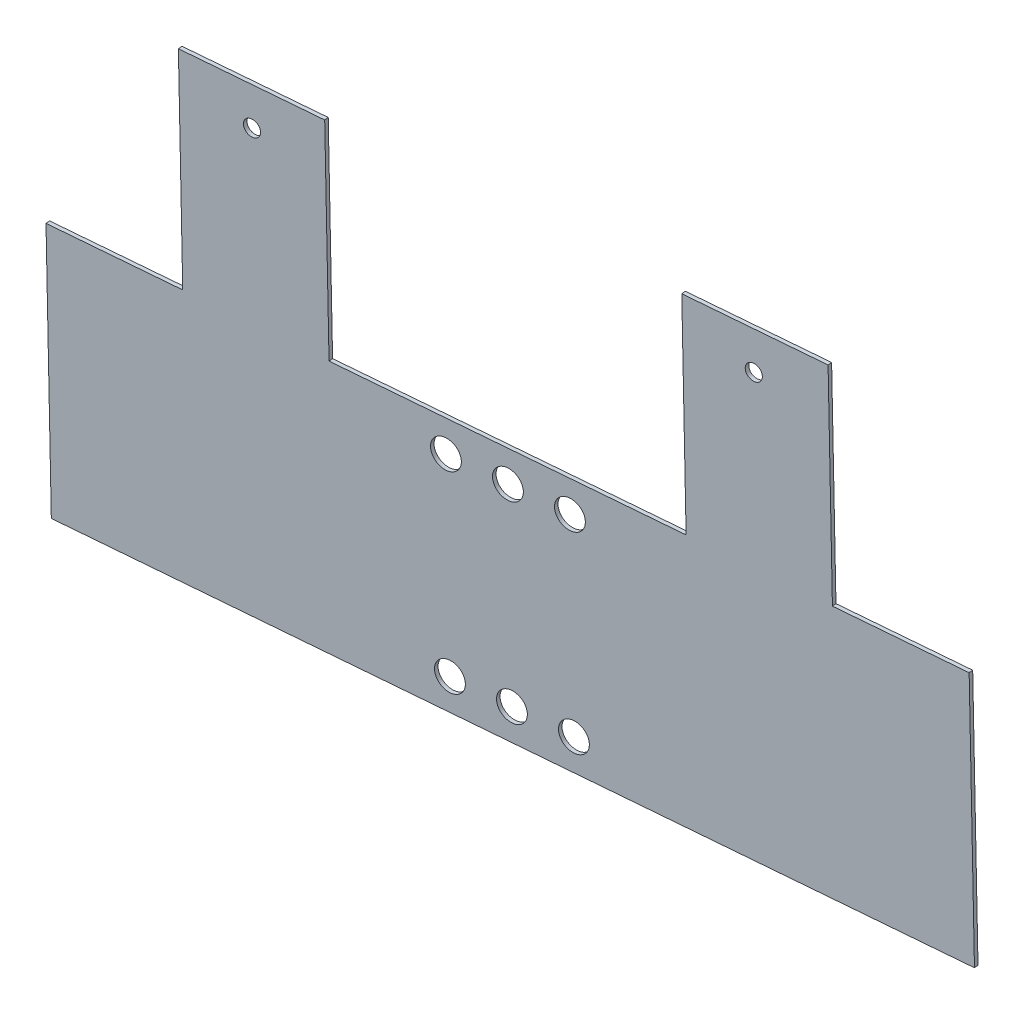
ISO-10303-21;
HEADER;
FILE_DESCRIPTION(('STEP AP214'),'2;1');
FILE_NAME('part.step','',(''),(''),'','','');
FILE_SCHEMA(('AUTOMOTIVE_DESIGN { 1 0 10303 214 1 1 1 1 }'));
ENDSEC;
DATA;
#1=APPLICATION_CONTEXT('core data for automotive mechanical design processes');
#2=APPLICATION_PROTOCOL_DEFINITION('international standard','automotive_design',2000,#1);
#3=PRODUCT_CONTEXT('',#1,'mechanical');
#4=PRODUCT('Part','Part','',(#3));
#5=PRODUCT_RELATED_PRODUCT_CATEGORY('part','',(#4));
#6=PRODUCT_DEFINITION_FORMATION('','',#4);
#7=PRODUCT_DEFINITION_CONTEXT('part definition',#1,'design');
#8=PRODUCT_DEFINITION('design','',#6,#7);
#9=PRODUCT_DEFINITION_SHAPE('','',#8);
#10=(LENGTH_UNIT() NAMED_UNIT(*) SI_UNIT(.MILLI.,.METRE.));
#11=(NAMED_UNIT(*) PLANE_ANGLE_UNIT() SI_UNIT($,.RADIAN.));
#12=(NAMED_UNIT(*) SI_UNIT($,.STERADIAN.) SOLID_ANGLE_UNIT());
#13=UNCERTAINTY_MEASURE_WITH_UNIT(LENGTH_MEASURE(1.E-05),#10,'distance_accuracy_value','');
#14=(GEOMETRIC_REPRESENTATION_CONTEXT(3) GLOBAL_UNCERTAINTY_ASSIGNED_CONTEXT((#13)) GLOBAL_UNIT_ASSIGNED_CONTEXT((#10,
#11,#12)) REPRESENTATION_CONTEXT('',''));
#15=CARTESIAN_POINT('',(0.,0.,0.));
#16=DIRECTION('',(0.,0.,1.));
#17=DIRECTION('',(1.,0.,0.));
#18=AXIS2_PLACEMENT_3D('',#15,#16,#17);
#19=CARTESIAN_POINT('',(-501.489956429642,-328.947406139133,240.499575413323));
#20=DIRECTION('',(0.99656940991837,0.00195950965151666,-0.0827379691367708));
#21=DIRECTION('',(-0.0827381279808112,0.,-0.996571323176736));
#22=AXIS2_PLACEMENT_3D('',#19,#20,#21);
#23=PLANE('',#22);
#24=DIRECTION('',(-0.00028055772663787,0.999793911631424,0.0202991515117986));
#25=VECTOR('',#24,1.);
#26=CARTESIAN_POINT('',(-501.439505510465,-328.959723900019,241.106959260261));
#27=LINE('',#26,#25);
#28=CARTESIAN_POINT('',(-501.439505510465,-328.959723900019,241.106959260261));
#29=VERTEX_POINT('',#28);
#30=CARTESIAN_POINT('',(-501.450907376476,-288.328099331318,241.9319167777));
#31=VERTEX_POINT('',#30);
#32=EDGE_CURVE('E344',#29,#31,#27,.T.);
#33=ORIENTED_EDGE('',*,*,#32,.T.);
#34=DIRECTION('',(0.082760694186997,-0.0202063006674291,0.99636457831008));
#35=VECTOR('',#34,1.);
#36=CARTESIAN_POINT('',(-501.501358295652,-288.315781570432,241.324532930762));
#37=LINE('',#36,#35);
#38=CARTESIAN_POINT('',(-501.501358295652,-288.315781570432,241.324532930762));
#39=VERTEX_POINT('',#38);
#40=EDGE_CURVE('E12',#39,#31,#37,.T.);
#41=ORIENTED_EDGE('',*,*,#40,.F.);
#42=DIRECTION('',(-0.00028055772663787,0.999793911631424,0.0202991515117986));
#43=VECTOR('',#42,1.);
#44=CARTESIAN_POINT('',(-501.489956429642,-328.947406139133,240.499575413323));
#45=LINE('',#44,#43);
#46=CARTESIAN_POINT('',(-501.489956429642,-328.947406139133,240.499575413323));
#47=VERTEX_POINT('',#46);
#48=EDGE_CURVE('E189',#47,#39,#45,.T.);
#49=ORIENTED_EDGE('',*,*,#48,.F.);
#50=DIRECTION('',(0.082760694186997,-0.0202063006674291,0.99636457831008));
#51=VECTOR('',#50,1.);
#52=CARTESIAN_POINT('',(-501.489956429642,-328.947406139133,240.499575413323));
#53=LINE('',#52,#51);
#54=EDGE_CURVE('E165',#47,#29,#53,.T.);
#55=ORIENTED_EDGE('',*,*,#54,.T.);
#56=EDGE_LOOP('',(#33,#41,#49,#55));
#57=FACE_BOUND('',#56,.T.);
#58=ADVANCED_FACE('F44',(#57),#23,.F.);
#59=CARTESIAN_POINT('',(-501.501358295652,-288.315781570432,241.324532930762));
#60=DIRECTION('',(0.000280557726639361,-0.999793911631424,-0.0202991515117988));
#61=DIRECTION('',(0.,0.0202991523106987,-0.999793950979634));
#62=AXIS2_PLACEMENT_3D('',#59,#60,#61);
#63=PLANE('',#62);
#64=DIRECTION('',(0.99656940991837,0.00195950965151815,-0.0827379691367705));
#65=VECTOR('',#64,1.);
#66=CARTESIAN_POINT('',(-501.450907376476,-288.328099331318,241.9319167777));
#67=LINE('',#66,#65);
#68=CARTESIAN_POINT('',(-481.580309912113,-288.289028668377,240.282204411082));
#69=VERTEX_POINT('',#68);
#70=EDGE_CURVE('E340',#31,#69,#67,.T.);
#71=ORIENTED_EDGE('',*,*,#70,.T.);
#72=DIRECTION('',(0.082760694186997,-0.0202063006674291,0.99636457831008));
#73=VECTOR('',#72,1.);
#74=CARTESIAN_POINT('',(-481.63076083129,-288.27671090749,239.674820564144));
#75=LINE('',#74,#73);
#76=CARTESIAN_POINT('',(-481.63076083129,-288.27671090749,239.674820564144));
#77=VERTEX_POINT('',#76);
#78=EDGE_CURVE('E52',#77,#69,#75,.T.);
#79=ORIENTED_EDGE('',*,*,#78,.F.);
#80=DIRECTION('',(0.99656940991837,0.00195950965151815,-0.0827379691367705));
#81=VECTOR('',#80,1.);
#82=CARTESIAN_POINT('',(-501.501358295652,-288.315781570432,241.324532930762));
#83=LINE('',#82,#81);
#84=EDGE_CURVE('E113',#39,#77,#83,.T.);
#85=ORIENTED_EDGE('',*,*,#84,.F.);
#86=ORIENTED_EDGE('',*,*,#40,.T.);
#87=EDGE_LOOP('',(#71,#79,#85,#86));
#88=FACE_BOUND('',#87,.T.);
#89=ADVANCED_FACE('F361',(#88),#63,.F.);
#90=CARTESIAN_POINT('',(-481.63076083129,-288.27671090749,239.674820564144));
#91=DIRECTION('',(0.99656940991837,0.00195950965151761,-0.0827379691367708));
#92=DIRECTION('',(-0.0827381279808112,0.,-0.996571323176736));
#93=AXIS2_PLACEMENT_3D('',#90,#91,#92);
#94=PLANE('',#93);
#95=DIRECTION('',(-0.000280557726638828,0.999793911631424,0.0202991515117985));
#96=VECTOR('',#95,1.);
#97=CARTESIAN_POINT('',(-481.580309912113,-288.289028668377,240.282204411082));
#98=LINE('',#97,#96);
#99=CARTESIAN_POINT('',(-481.589628158372,-255.082579541952,240.956406098194));
#100=VERTEX_POINT('',#99);
#101=EDGE_CURVE('E288',#69,#100,#98,.T.);
#102=ORIENTED_EDGE('',*,*,#101,.T.);
#103=DIRECTION('',(0.082760694186997,-0.0202063006674291,0.99636457831008));
#104=VECTOR('',#103,1.);
#105=CARTESIAN_POINT('',(-481.640079077549,-255.070261781065,240.349022251256));
#106=LINE('',#105,#104);
#107=CARTESIAN_POINT('',(-481.640079077549,-255.070261781065,240.349022251256));
#108=VERTEX_POINT('',#107);
#109=EDGE_CURVE('E285',#108,#100,#106,.T.);
#110=ORIENTED_EDGE('',*,*,#109,.F.);
#111=DIRECTION('',(-0.000280557726638828,0.999793911631424,0.0202991515117985));
#112=VECTOR('',#111,1.);
#113=CARTESIAN_POINT('',(-481.63076083129,-288.27671090749,239.674820564144));
#114=LINE('',#113,#112);
#115=EDGE_CURVE('E195',#77,#108,#114,.T.);
#116=ORIENTED_EDGE('',*,*,#115,.F.);
#117=ORIENTED_EDGE('',*,*,#78,.T.);
#118=EDGE_LOOP('',(#102,#110,#116,#117));
#119=FACE_BOUND('',#118,.T.);
#120=ADVANCED_FACE('F286',(#119),#94,.F.);
#121=CARTESIAN_POINT('',(-481.640079077549,-255.070261781065,240.349022251256));
#122=DIRECTION('',(0.000280557726637701,-0.999793911631424,-0.0202991515117986));
#123=DIRECTION('',(0.,0.0202991523106985,-0.999793950979634));
#124=AXIS2_PLACEMENT_3D('',#121,#122,#123);
#125=PLANE('',#124);
#126=DIRECTION('',(0.99656940991837,0.00195950965151649,-0.0827379691367709));
#127=VECTOR('',#126,1.);
#128=CARTESIAN_POINT('',(-481.589628158372,-255.082579541952,240.956406098194));
#129=LINE('',#128,#127);
#130=CARTESIAN_POINT('',(-460.326823228354,-255.040771444027,239.191108788692));
#131=VERTEX_POINT('',#130);
#132=EDGE_CURVE('E296',#100,#131,#129,.T.);
#133=ORIENTED_EDGE('',*,*,#132,.T.);
#134=DIRECTION('',(0.082760694186997,-0.0202063006674291,0.99636457831008));
#135=VECTOR('',#134,1.);
#136=CARTESIAN_POINT('',(-460.37727414753,-255.028453683141,238.583724941754));
#137=LINE('',#136,#135);
#138=CARTESIAN_POINT('',(-460.37727414753,-255.028453683141,238.583724941754));
#139=VERTEX_POINT('',#138);
#140=EDGE_CURVE('E291',#139,#131,#137,.T.);
#141=ORIENTED_EDGE('',*,*,#140,.F.);
#142=DIRECTION('',(0.99656940991837,0.00195950965151649,-0.0827379691367709));
#143=VECTOR('',#142,1.);
#144=CARTESIAN_POINT('',(-481.640079077549,-255.070261781065,240.349022251256));
#145=LINE('',#144,#143);
#146=EDGE_CURVE('E274',#108,#139,#145,.T.);
#147=ORIENTED_EDGE('',*,*,#146,.F.);
#148=ORIENTED_EDGE('',*,*,#109,.T.);
#149=EDGE_LOOP('',(#133,#141,#147,#148));
#150=FACE_BOUND('',#149,.T.);
#151=ADVANCED_FACE('F293',(#150),#125,.F.);
#152=CARTESIAN_POINT('',(-460.367955901271,-288.234902809565,237.909523254642));
#153=DIRECTION('',(-0.99656940991837,-0.00195950965151761,0.0827379691367708));
#154=DIRECTION('',(0.0827381279808112,0.,0.996571323176736));
#155=AXIS2_PLACEMENT_3D('',#152,#153,#154);
#156=PLANE('',#155);
#157=DIRECTION('',(0.000280557726638828,-0.999793911631424,-0.0202991515117985));
#158=VECTOR('',#157,1.);
#159=CARTESIAN_POINT('',(-460.317504982095,-288.247220570452,238.51690710158));
#160=LINE('',#159,#158);
#161=CARTESIAN_POINT('',(-460.317504982095,-288.247220570452,238.51690710158));
#162=VERTEX_POINT('',#161);
#163=EDGE_CURVE('E342',#131,#162,#160,.T.);
#164=ORIENTED_EDGE('',*,*,#163,.T.);
#165=DIRECTION('',(0.082760694186997,-0.0202063006674291,0.99636457831008));
#166=VECTOR('',#165,1.);
#167=CARTESIAN_POINT('',(-460.367955901271,-288.234902809565,237.909523254642));
#168=LINE('',#167,#166);
#169=CARTESIAN_POINT('',(-460.367955901271,-288.234902809565,237.909523254642));
#170=VERTEX_POINT('',#169);
#171=EDGE_CURVE('E299',#170,#162,#168,.T.);
#172=ORIENTED_EDGE('',*,*,#171,.F.);
#173=DIRECTION('',(0.000280557726638828,-0.999793911631424,-0.0202991515117985));
#174=VECTOR('',#173,1.);
#175=CARTESIAN_POINT('',(-460.367955901271,-288.234902809565,237.909523254642));
#176=LINE('',#175,#174);
#177=EDGE_CURVE('E271',#139,#170,#176,.T.);
#178=ORIENTED_EDGE('',*,*,#177,.F.);
#179=ORIENTED_EDGE('',*,*,#140,.T.);
#180=EDGE_LOOP('',(#164,#172,#178,#179));
#181=FACE_BOUND('',#180,.T.);
#182=ADVANCED_FACE('F302',(#181),#156,.F.);
#183=CARTESIAN_POINT('',(-460.367955901271,-288.234902809565,237.909523254642));
#184=DIRECTION('',(0.000280557726638658,-0.999793911631424,-0.0202991515117987));
#185=DIRECTION('',(0.,0.0202991523106986,-0.999793950979634));
#186=AXIS2_PLACEMENT_3D('',#183,#184,#185);
#187=PLANE('',#186);
#188=DIRECTION('',(0.99656940991837,0.00195950965151746,-0.0827379691367711));
#189=VECTOR('',#188,1.);
#190=CARTESIAN_POINT('',(-460.317504982095,-288.247220570452,238.51690710158));
#191=LINE('',#190,#189);
#192=CARTESIAN_POINT('',(-408.426135807645,-288.145188902897,234.208741048628));
#193=VERTEX_POINT('',#192);
#194=EDGE_CURVE('E314',#162,#193,#191,.T.);
#195=ORIENTED_EDGE('',*,*,#194,.T.);
#196=DIRECTION('',(0.082760694186997,-0.0202063006674291,0.99636457831008));
#197=VECTOR('',#196,1.);
#198=CARTESIAN_POINT('',(-408.476586726822,-288.132871142011,233.60135720169));
#199=LINE('',#198,#197);
#200=CARTESIAN_POINT('',(-408.476586726822,-288.132871142011,233.60135720169));
#201=VERTEX_POINT('',#200);
#202=EDGE_CURVE('E311',#201,#193,#199,.T.);
#203=ORIENTED_EDGE('',*,*,#202,.F.);
#204=DIRECTION('',(0.99656940991837,0.00195950965151746,-0.0827379691367711));
#205=VECTOR('',#204,1.);
#206=CARTESIAN_POINT('',(-460.367955901271,-288.234902809565,237.909523254642));
#207=LINE('',#206,#205);
#208=EDGE_CURVE('E266',#170,#201,#207,.T.);
#209=ORIENTED_EDGE('',*,*,#208,.F.);
#210=ORIENTED_EDGE('',*,*,#171,.T.);
#211=EDGE_LOOP('',(#195,#203,#209,#210));
#212=FACE_BOUND('',#211,.T.);
#213=ADVANCED_FACE('F312',(#212),#187,.F.);
#214=CARTESIAN_POINT('',(-408.476586726822,-288.132871142011,233.60135720169));
#215=DIRECTION('',(0.99656940991837,0.00195950965151761,-0.0827379691367708));
#216=DIRECTION('',(-0.0827381279808112,0.,-0.996571323176736));
#217=AXIS2_PLACEMENT_3D('',#214,#215,#216);
#218=PLANE('',#217);
#219=DIRECTION('',(-0.000280557726638828,0.999793911631424,0.0202991515117985));
#220=VECTOR('',#219,1.);
#221=CARTESIAN_POINT('',(-408.426135807645,-288.145188902897,234.208741048628));
#222=LINE('',#221,#220);
#223=CARTESIAN_POINT('',(-408.435454053904,-254.938739776473,234.88294273574));
#224=VERTEX_POINT('',#223);
#225=EDGE_CURVE('E322',#193,#224,#222,.T.);
#226=ORIENTED_EDGE('',*,*,#225,.T.);
#227=DIRECTION('',(0.082760694186997,-0.0202063006674291,0.99636457831008));
#228=VECTOR('',#227,1.);
#229=CARTESIAN_POINT('',(-408.485904973081,-254.926422015586,234.275558888802));
#230=LINE('',#229,#228);
#231=CARTESIAN_POINT('',(-408.485904973081,-254.926422015586,234.275558888802));
#232=VERTEX_POINT('',#231);
#233=EDGE_CURVE('E317',#232,#224,#230,.T.);
#234=ORIENTED_EDGE('',*,*,#233,.F.);
#235=DIRECTION('',(-0.000280557726638828,0.999793911631424,0.0202991515117985));
#236=VECTOR('',#235,1.);
#237=CARTESIAN_POINT('',(-408.476586726822,-288.132871142011,233.60135720169));
#238=LINE('',#237,#236);
#239=EDGE_CURVE('E262',#201,#232,#238,.T.);
#240=ORIENTED_EDGE('',*,*,#239,.F.);
#241=ORIENTED_EDGE('',*,*,#202,.T.);
#242=EDGE_LOOP('',(#226,#234,#240,#241));
#243=FACE_BOUND('',#242,.T.);
#244=ADVANCED_FACE('F319',(#243),#218,.F.);
#245=CARTESIAN_POINT('',(-408.485904973081,-254.926422015586,234.275558888802));
#246=DIRECTION('',(0.000280557726637727,-0.999793911631424,-0.0202991515117986));
#247=DIRECTION('',(0.,0.0202991523106985,-0.999793950979634));
#248=AXIS2_PLACEMENT_3D('',#245,#246,#247);
#249=PLANE('',#248);
#250=DIRECTION('',(0.99656940991837,0.00195950965151649,-0.0827379691367696));
#251=VECTOR('',#250,1.);
#252=CARTESIAN_POINT('',(-408.435454053904,-254.938739776473,234.88294273574));
#253=LINE('',#252,#251);
#254=CARTESIAN_POINT('',(-387.172649123886,-254.896931678548,233.117645426238));
#255=VERTEX_POINT('',#254);
#256=EDGE_CURVE('E330',#224,#255,#253,.T.);
#257=ORIENTED_EDGE('',*,*,#256,.T.);
#258=DIRECTION('',(0.082760694186997,-0.0202063006674291,0.99636457831008));
#259=VECTOR('',#258,1.);
#260=CARTESIAN_POINT('',(-387.223100043062,-254.884613917661,232.5102615793));
#261=LINE('',#260,#259);
#262=CARTESIAN_POINT('',(-387.223100043062,-254.884613917661,232.5102615793));
#263=VERTEX_POINT('',#262);
#264=EDGE_CURVE('E325',#263,#255,#261,.T.);
#265=ORIENTED_EDGE('',*,*,#264,.F.);
#266=DIRECTION('',(0.99656940991837,0.00195950965151649,-0.0827379691367696));
#267=VECTOR('',#266,1.);
#268=CARTESIAN_POINT('',(-408.485904973081,-254.926422015586,234.275558888802));
#269=LINE('',#268,#267);
#270=EDGE_CURVE('E258',#232,#263,#269,.T.);
#271=ORIENTED_EDGE('',*,*,#270,.F.);
#272=ORIENTED_EDGE('',*,*,#233,.T.);
#273=EDGE_LOOP('',(#257,#265,#271,#272));
#274=FACE_BOUND('',#273,.T.);
#275=ADVANCED_FACE('F328',(#274),#249,.F.);
#276=CARTESIAN_POINT('',(-387.213781796803,-288.091063044086,231.836059892188));
#277=DIRECTION('',(-0.99656940991837,-0.00195950965151767,0.0827379691367708));
#278=DIRECTION('',(0.0827381279808112,0.,0.996571323176736));
#279=AXIS2_PLACEMENT_3D('',#276,#277,#278);
#280=PLANE('',#279);
#281=DIRECTION('',(0.000280557726638828,-0.999793911631424,-0.0202991515117993));
#282=VECTOR('',#281,1.);
#283=CARTESIAN_POINT('',(-387.163330877627,-288.103380804973,232.443443739126));
#284=LINE('',#283,#282);
#285=CARTESIAN_POINT('',(-387.163330877627,-288.103380804973,232.443443739126));
#286=VERTEX_POINT('',#285);
#287=EDGE_CURVE('E335',#255,#286,#284,.T.);
#288=ORIENTED_EDGE('',*,*,#287,.T.);
#289=DIRECTION('',(0.082760694186997,-0.0202063006674291,0.99636457831008));
#290=VECTOR('',#289,1.);
#291=CARTESIAN_POINT('',(-387.213781796803,-288.091063044086,231.836059892188));
#292=LINE('',#291,#290);
#293=CARTESIAN_POINT('',(-387.213781796803,-288.091063044086,231.836059892188));
#294=VERTEX_POINT('',#293);
#295=EDGE_CURVE('E157',#294,#286,#292,.T.);
#296=ORIENTED_EDGE('',*,*,#295,.F.);
#297=DIRECTION('',(0.000280557726638828,-0.999793911631424,-0.0202991515117993));
#298=VECTOR('',#297,1.);
#299=CARTESIAN_POINT('',(-387.213781796803,-288.091063044086,231.836059892188));
#300=LINE('',#299,#298);
#301=EDGE_CURVE('E145',#263,#294,#300,.T.);
#302=ORIENTED_EDGE('',*,*,#301,.F.);
#303=ORIENTED_EDGE('',*,*,#264,.T.);
#304=EDGE_LOOP('',(#288,#296,#302,#303));
#305=FACE_BOUND('',#304,.T.);
#306=ADVANCED_FACE('F334',(#305),#280,.F.);
#307=CARTESIAN_POINT('',(-387.213781796803,-288.091063044086,231.836059892188));
#308=DIRECTION('',(0.000280557726639361,-0.999793911631424,-0.0202991515117988));
#309=DIRECTION('',(0.,0.0202991523106987,-0.999793950979634));
#310=AXIS2_PLACEMENT_3D('',#307,#308,#309);
#311=PLANE('',#310);
#312=DIRECTION('',(0.99656940991837,0.00195950965151815,-0.0827379691367705));
#313=VECTOR('',#312,1.);
#314=CARTESIAN_POINT('',(-387.163330877627,-288.103380804973,232.443443739126));
#315=LINE('',#314,#313);
#316=CARTESIAN_POINT('',(-367.292733413265,-288.064310142031,230.793731372508));
#317=VERTEX_POINT('',#316);
#318=EDGE_CURVE('E155',#286,#317,#315,.T.);
#319=ORIENTED_EDGE('',*,*,#318,.T.);
#320=DIRECTION('',(0.082760694186997,-0.0202063006674291,0.99636457831008));
#321=VECTOR('',#320,1.);
#322=CARTESIAN_POINT('',(-367.343184332441,-288.051992381144,230.18634752557));
#323=LINE('',#322,#321);
#324=CARTESIAN_POINT('',(-367.343184332441,-288.051992381144,230.18634752557));
#325=VERTEX_POINT('',#324);
#326=EDGE_CURVE('E152',#325,#317,#323,.T.);
#327=ORIENTED_EDGE('',*,*,#326,.F.);
#328=DIRECTION('',(0.99656940991837,0.00195950965151815,-0.0827379691367705));
#329=VECTOR('',#328,1.);
#330=CARTESIAN_POINT('',(-387.213781796803,-288.091063044086,231.836059892188));
#331=LINE('',#330,#329);
#332=EDGE_CURVE('E138',#294,#325,#331,.T.);
#333=ORIENTED_EDGE('',*,*,#332,.F.);
#334=ORIENTED_EDGE('',*,*,#295,.T.);
#335=EDGE_LOOP('',(#319,#327,#333,#334));
#336=FACE_BOUND('',#335,.T.);
#337=ADVANCED_FACE('F153',(#336),#311,.F.);
#338=CARTESIAN_POINT('',(-367.331782466431,-328.683616949845,229.361390008131));
#339=DIRECTION('',(-0.99656940991837,-0.00195950965151388,0.0827379691367708));
#340=DIRECTION('',(0.0827381279808113,0.,0.996571323176736));
#341=AXIS2_PLACEMENT_3D('',#338,#339,#340);
#342=PLANE('',#341);
#343=DIRECTION('',(0.000280557726635138,-0.999793911631424,-0.0202991515117979));
#344=VECTOR('',#343,1.);
#345=CARTESIAN_POINT('',(-367.281331547254,-328.695934710732,229.968773855068));
#346=LINE('',#345,#344);
#347=CARTESIAN_POINT('',(-367.281331547254,-328.695934710732,229.968773855068));
#348=VERTEX_POINT('',#347);
#349=EDGE_CURVE('E353',#317,#348,#346,.T.);
#350=ORIENTED_EDGE('',*,*,#349,.T.);
#351=DIRECTION('',(0.082760694186997,-0.0202063006674291,0.99636457831008));
#352=VECTOR('',#351,1.);
#353=CARTESIAN_POINT('',(-367.331782466431,-328.683616949845,229.361390008131));
#354=LINE('',#353,#352);
#355=CARTESIAN_POINT('',(-367.331782466431,-328.683616949845,229.361390008131));
#356=VERTEX_POINT('',#355);
#357=EDGE_CURVE('E158',#356,#348,#354,.T.);
#358=ORIENTED_EDGE('',*,*,#357,.F.);
#359=DIRECTION('',(0.000280557726635138,-0.999793911631424,-0.0202991515117979));
#360=VECTOR('',#359,1.);
#361=CARTESIAN_POINT('',(-367.331782466431,-328.683616949845,229.361390008131));
#362=LINE('',#361,#360);
#363=EDGE_CURVE('E142',#325,#356,#362,.T.);
#364=ORIENTED_EDGE('',*,*,#363,.F.);
#365=ORIENTED_EDGE('',*,*,#326,.T.);
#366=EDGE_LOOP('',(#350,#358,#364,#365));
#367=FACE_BOUND('',#366,.T.);
#368=ADVANCED_FACE('F160',(#367),#342,.F.);
#369=CARTESIAN_POINT('',(-501.489956429642,-328.947406139133,240.499575413323));
#370=DIRECTION('',(-0.000280557726639361,0.999793911631424,0.0202991515117988));
#371=DIRECTION('',(0.,-0.0202991523106987,0.999793950979634));
#372=AXIS2_PLACEMENT_3D('',#369,#370,#371);
#373=PLANE('',#372);
#374=DIRECTION('',(-0.99656940991837,-0.00195950965151815,0.0827379691367705));
#375=VECTOR('',#374,1.);
#376=CARTESIAN_POINT('',(-501.439505510465,-328.959723900019,241.106959260261));
#377=LINE('',#376,#375);
#378=EDGE_CURVE('E101',#348,#29,#377,.T.);
#379=ORIENTED_EDGE('',*,*,#378,.T.);
#380=ORIENTED_EDGE('',*,*,#54,.F.);
#381=DIRECTION('',(-0.99656940991837,-0.00195950965151794,0.0827379691367709));
#382=VECTOR('',#381,1.);
#383=CARTESIAN_POINT('',(-386.587283527019,-328.721478176367,230.960035357474));
#384=LINE('',#383,#382);
#385=EDGE_CURVE('E60',#356,#47,#384,.T.);
#386=ORIENTED_EDGE('',*,*,#385,.F.);
#387=ORIENTED_EDGE('',*,*,#357,.T.);
#388=EDGE_LOOP('',(#379,#380,#386,#387));
#389=FACE_BOUND('',#388,.T.);
#390=ADVANCED_FACE('F356',(#389),#373,.F.);
#391=CARTESIAN_POINT('',(16.9467758676456,-4.13761208613666,204.023991786853));
#392=DIRECTION('',(-0.0827606941869968,0.0202063006674291,-0.99636457831008));
#393=DIRECTION('',(-0.996568045750024,0.,0.0827775947341869));
#394=AXIS2_PLACEMENT_3D('',#391,#392,#393);
#395=PLANE('',#394);
#396=CARTESIAN_POINT('',(-471.054813760999,-261.10108861582,239.347476604441));
#397=DIRECTION('',(-0.0827606941869969,0.0202063006674291,-0.99636457831008));
#398=DIRECTION('',(-0.996568045750024,0.,0.0827775947341869));
#399=AXIS2_PLACEMENT_3D('',#396,#397,#398);
#400=CIRCLE('',#399,1.25000000000001);
#401=CARTESIAN_POINT('',(-472.300523818187,-261.10108861582,239.450948597859));
#402=VERTEX_POINT('',#401);
#403=EDGE_CURVE('E206',#402,#402,#400,.T.);
#404=ORIENTED_EDGE('',*,*,#403,.F.);
#405=EDGE_LOOP('',(#404));
#406=FACE_BOUND('',#405,.T.);
#407=CARTESIAN_POINT('',(-398.13117772993,-260.957702145591,233.293153155214));
#408=DIRECTION('',(-0.0827606941869968,0.0202063006674291,-0.99636457831008));
#409=DIRECTION('',(-0.996568045750024,0.,0.0827775947341869));
#410=AXIS2_PLACEMENT_3D('',#407,#408,#409);
#411=CIRCLE('',#410,1.24999999999994);
#412=CARTESIAN_POINT('',(-399.376887787118,-260.957702145591,233.396625148631));
#413=VERTEX_POINT('',#412);
#414=EDGE_CURVE('E213',#413,#413,#411,.T.);
#415=ORIENTED_EDGE('',*,*,#414,.F.);
#416=EDGE_LOOP('',(#415));
#417=FACE_BOUND('',#416,.T.);
#418=CARTESIAN_POINT('',(-443.473097110312,-293.200655525,236.40548570979));
#419=DIRECTION('',(0.0827606941869969,-0.0202063006674291,0.99636457831008));
#420=DIRECTION('',(-0.996566946014347,-0.00391901177606996,0.0826980257221201));
#421=AXIS2_PLACEMENT_3D('',#418,#419,#420);
#422=CIRCLE('',#421,2.24999999999997);
#423=CARTESIAN_POINT('',(-445.715372738845,-293.209473301496,236.591556267665));
#424=VERTEX_POINT('',#423);
#425=EDGE_CURVE('E222',#424,#424,#422,.T.);
#426=ORIENTED_EDGE('',*,*,#425,.T.);
#427=EDGE_LOOP('',(#426));
#428=FACE_BOUND('',#427,.T.);
#429=CARTESIAN_POINT('',(-434.464565062866,-293.182942453393,235.657572278879));
#430=DIRECTION('',(0.0827606941869969,-0.0202063006674291,0.99636457831008));
#431=DIRECTION('',(-0.996566946014347,-0.00391901177606996,0.0826980257221201));
#432=AXIS2_PLACEMENT_3D('',#429,#430,#431);
#433=CIRCLE('',#432,2.24999999999995);
#434=CARTESIAN_POINT('',(-436.706840691398,-293.191760229889,235.843642836754));
#435=VERTEX_POINT('',#434);
#436=EDGE_CURVE('E232',#435,#435,#433,.T.);
#437=ORIENTED_EDGE('',*,*,#436,.T.);
#438=EDGE_LOOP('',(#437));
#439=FACE_BOUND('',#438,.T.);
#440=CARTESIAN_POINT('',(-425.456033015419,-293.165229381785,234.909658847968));
#441=DIRECTION('',(0.0827606941869969,-0.0202063006674291,0.99636457831008));
#442=DIRECTION('',(-0.996566946014347,-0.00391901177606996,0.0826980257221201));
#443=AXIS2_PLACEMENT_3D('',#440,#441,#442);
#444=CIRCLE('',#443,2.24999999999995);
#445=CARTESIAN_POINT('',(-427.698308643951,-293.174047158281,235.095729405843));
#446=VERTEX_POINT('',#445);
#447=EDGE_CURVE('E221',#446,#446,#444,.T.);
#448=ORIENTED_EDGE('',*,*,#447,.T.);
#449=EDGE_LOOP('',(#448));
#450=FACE_BOUND('',#449,.T.);
#451=CARTESIAN_POINT('',(-443.464500821569,-323.834340975916,235.783519707498));
#452=DIRECTION('',(-0.0827606941869969,0.0202063006674291,-0.99636457831008));
#453=DIRECTION('',(-0.996568045750024,0.,0.0827775947341869));
#454=AXIS2_PLACEMENT_3D('',#451,#452,#453);
#455=CIRCLE('',#454,2.24999999999997);
#456=CARTESIAN_POINT('',(-445.706778924506,-323.834340975916,235.96976929565));
#457=VERTEX_POINT('',#456);
#458=EDGE_CURVE('E247',#457,#457,#455,.T.);
#459=ORIENTED_EDGE('',*,*,#458,.F.);
#460=EDGE_LOOP('',(#459));
#461=FACE_BOUND('',#460,.T.);
#462=CARTESIAN_POINT('',(-434.455968774122,-323.816627903961,235.035606276595));
#463=DIRECTION('',(-0.0827606941869969,0.0202063006674291,-0.99636457831008));
#464=DIRECTION('',(-0.996568045750024,0.,0.0827775947341869));
#465=AXIS2_PLACEMENT_3D('',#462,#463,#464);
#466=CIRCLE('',#465,2.24999999999995);
#467=CARTESIAN_POINT('',(-436.69824687706,-323.816627903961,235.221855864746));
#468=VERTEX_POINT('',#467);
#469=EDGE_CURVE('E188',#468,#468,#466,.T.);
#470=ORIENTED_EDGE('',*,*,#469,.F.);
#471=EDGE_LOOP('',(#470));
#472=FACE_BOUND('',#471,.T.);
#473=CARTESIAN_POINT('',(-425.447436726675,-323.798914832006,234.287692845691));
#474=DIRECTION('',(-0.0827606941869969,0.0202063006674291,-0.99636457831008));
#475=DIRECTION('',(-0.996568045750024,0.,0.0827775947341869));
#476=AXIS2_PLACEMENT_3D('',#473,#474,#475);
#477=CIRCLE('',#476,2.24999999999995);
#478=CARTESIAN_POINT('',(-427.689714829613,-323.798914832006,234.473942433843));
#479=VERTEX_POINT('',#478);
#480=EDGE_CURVE('E178',#479,#479,#477,.T.);
#481=ORIENTED_EDGE('',*,*,#480,.F.);
#482=EDGE_LOOP('',(#481));
#483=FACE_BOUND('',#482,.T.);
#484=ORIENTED_EDGE('',*,*,#48,.T.);
#485=ORIENTED_EDGE('',*,*,#84,.T.);
#486=ORIENTED_EDGE('',*,*,#115,.T.);
#487=ORIENTED_EDGE('',*,*,#146,.T.);
#488=ORIENTED_EDGE('',*,*,#177,.T.);
#489=ORIENTED_EDGE('',*,*,#208,.T.);
#490=ORIENTED_EDGE('',*,*,#239,.T.);
#491=ORIENTED_EDGE('',*,*,#270,.T.);
#492=ORIENTED_EDGE('',*,*,#301,.T.);
#493=ORIENTED_EDGE('',*,*,#332,.T.);
#494=ORIENTED_EDGE('',*,*,#363,.T.);
#495=ORIENTED_EDGE('',*,*,#385,.T.);
#496=EDGE_LOOP('',(#484,#485,#486,#487,#488,#489,#490,#491,#492,#493,#494,#495));
#497=FACE_BOUND('',#496,.T.);
#498=ADVANCED_FACE('F140',(#406,#417,#428,#439,#450,#461,#472,#483,#497),#395,.T.);
#499=CARTESIAN_POINT('',(16.997226786822,-4.14992984702352,204.631375633791));
#500=DIRECTION('',(-0.0827606941869968,0.0202063006674291,-0.99636457831008));
#501=DIRECTION('',(-0.996568045750024,0.,0.0827775947341869));
#502=AXIS2_PLACEMENT_3D('',#499,#500,#501);
#503=PLANE('',#502);
#504=CARTESIAN_POINT('',(-471.004362841823,-261.113406376707,239.954860451379));
#505=DIRECTION('',(-0.0827606941869968,0.0202063006674291,-0.99636457831008));
#506=DIRECTION('',(-0.996568045750024,0.,0.0827775947341869));
#507=AXIS2_PLACEMENT_3D('',#504,#505,#506);
#508=CIRCLE('',#507,1.25000000000001);
#509=CARTESIAN_POINT('',(-472.25007289901,-261.113406376707,240.058332444796));
#510=VERTEX_POINT('',#509);
#511=EDGE_CURVE('E211',#510,#510,#508,.F.);
#512=ORIENTED_EDGE('',*,*,#511,.F.);
#513=EDGE_LOOP('',(#512));
#514=FACE_BOUND('',#513,.T.);
#515=CARTESIAN_POINT('',(-398.080726810754,-260.970019906477,233.900537002151));
#516=DIRECTION('',(-0.0827606941869968,0.0202063006674291,-0.99636457831008));
#517=DIRECTION('',(-0.996568045750024,0.,0.0827775947341869));
#518=AXIS2_PLACEMENT_3D('',#515,#516,#517);
#519=CIRCLE('',#518,1.24999999999994);
#520=CARTESIAN_POINT('',(-399.326436867941,-260.970019906477,234.004008995569));
#521=VERTEX_POINT('',#520);
#522=EDGE_CURVE('E218',#521,#521,#519,.F.);
#523=ORIENTED_EDGE('',*,*,#522,.F.);
#524=EDGE_LOOP('',(#523));
#525=FACE_BOUND('',#524,.T.);
#526=CARTESIAN_POINT('',(-443.422646191136,-293.212973285887,237.012869556728));
#527=DIRECTION('',(-0.0827606941869968,0.0202063006674291,-0.99636457831008));
#528=DIRECTION('',(-0.996568045750024,0.,0.0827775947341869));
#529=AXIS2_PLACEMENT_3D('',#526,#527,#528);
#530=CIRCLE('',#529,2.24999999999997);
#531=CARTESIAN_POINT('',(-445.664924294074,-293.212973285887,237.19911914488));
#532=VERTEX_POINT('',#531);
#533=EDGE_CURVE('E185',#532,#532,#530,.T.);
#534=ORIENTED_EDGE('',*,*,#533,.T.);
#535=EDGE_LOOP('',(#534));
#536=FACE_BOUND('',#535,.T.);
#537=CARTESIAN_POINT('',(-434.414114143689,-293.19526021428,236.264956125817));
#538=DIRECTION('',(-0.0827606941869968,0.0202063006674291,-0.99636457831008));
#539=DIRECTION('',(-0.996568045750024,0.,0.0827775947341869));
#540=AXIS2_PLACEMENT_3D('',#537,#538,#539);
#541=CIRCLE('',#540,2.24999999999995);
#542=CARTESIAN_POINT('',(-436.656392246627,-293.19526021428,236.451205713969));
#543=VERTEX_POINT('',#542);
#544=EDGE_CURVE('E227',#543,#543,#541,.T.);
#545=ORIENTED_EDGE('',*,*,#544,.T.);
#546=EDGE_LOOP('',(#545));
#547=FACE_BOUND('',#546,.T.);
#548=CARTESIAN_POINT('',(-425.405582096243,-293.177547142672,235.517042694906));
#549=DIRECTION('',(-0.0827606941869968,0.0202063006674291,-0.99636457831008));
#550=DIRECTION('',(-0.996568045750024,0.,0.0827775947341869));
#551=AXIS2_PLACEMENT_3D('',#548,#549,#550);
#552=CIRCLE('',#551,2.24999999999995);
#553=CARTESIAN_POINT('',(-427.64786019918,-293.177547142672,235.703292283058));
#554=VERTEX_POINT('',#553);
#555=EDGE_CURVE('E237',#554,#554,#552,.T.);
#556=ORIENTED_EDGE('',*,*,#555,.T.);
#557=EDGE_LOOP('',(#556));
#558=FACE_BOUND('',#557,.T.);
#559=CARTESIAN_POINT('',(-443.414049902392,-323.846658736803,236.390903554436));
#560=DIRECTION('',(-0.0827606941869968,0.0202063006674291,-0.99636457831008));
#561=DIRECTION('',(-0.996568045750024,0.,0.0827775947341869));
#562=AXIS2_PLACEMENT_3D('',#559,#560,#561);
#563=CIRCLE('',#562,2.24999999999997);
#564=CARTESIAN_POINT('',(-445.65632800533,-323.846658736803,236.577153142588));
#565=VERTEX_POINT('',#564);
#566=EDGE_CURVE('E451',#565,#565,#563,.F.);
#567=ORIENTED_EDGE('',*,*,#566,.F.);
#568=EDGE_LOOP('',(#567));
#569=FACE_BOUND('',#568,.T.);
#570=CARTESIAN_POINT('',(-434.405517854946,-323.828945664848,235.642990123532));
#571=DIRECTION('',(-0.0827606941869968,0.0202063006674291,-0.99636457831008));
#572=DIRECTION('',(-0.996568045750024,0.,0.0827775947341869));
#573=AXIS2_PLACEMENT_3D('',#570,#571,#572);
#574=CIRCLE('',#573,2.24999999999995);
#575=CARTESIAN_POINT('',(-436.647795957883,-323.828945664848,235.829239711684));
#576=VERTEX_POINT('',#575);
#577=EDGE_CURVE('E186',#576,#576,#574,.F.);
#578=ORIENTED_EDGE('',*,*,#577,.F.);
#579=EDGE_LOOP('',(#578));
#580=FACE_BOUND('',#579,.T.);
#581=CARTESIAN_POINT('',(-425.396985807499,-323.811232592893,234.895076692629));
#582=DIRECTION('',(-0.0827606941869968,0.0202063006674291,-0.99636457831008));
#583=DIRECTION('',(-0.996568045750024,0.,0.0827775947341869));
#584=AXIS2_PLACEMENT_3D('',#581,#582,#583);
#585=CIRCLE('',#584,2.24999999999995);
#586=CARTESIAN_POINT('',(-427.639263910437,-323.811232592893,235.08132628078));
#587=VERTEX_POINT('',#586);
#588=EDGE_CURVE('E184',#587,#587,#585,.F.);
#589=ORIENTED_EDGE('',*,*,#588,.F.);
#590=EDGE_LOOP('',(#589));
#591=FACE_BOUND('',#590,.T.);
#592=ORIENTED_EDGE('',*,*,#32,.F.);
#593=ORIENTED_EDGE('',*,*,#378,.F.);
#594=ORIENTED_EDGE('',*,*,#349,.F.);
#595=ORIENTED_EDGE('',*,*,#318,.F.);
#596=ORIENTED_EDGE('',*,*,#287,.F.);
#597=ORIENTED_EDGE('',*,*,#256,.F.);
#598=ORIENTED_EDGE('',*,*,#225,.F.);
#599=ORIENTED_EDGE('',*,*,#194,.F.);
#600=ORIENTED_EDGE('',*,*,#163,.F.);
#601=ORIENTED_EDGE('',*,*,#132,.F.);
#602=ORIENTED_EDGE('',*,*,#101,.F.);
#603=ORIENTED_EDGE('',*,*,#70,.F.);
#604=EDGE_LOOP('',(#592,#593,#594,#595,#596,#597,#598,#599,#600,#601,#602,#603));
#605=FACE_BOUND('',#604,.T.);
#606=ADVANCED_FACE('F339',(#514,#525,#536,#547,#558,#569,#580,#591,#605),#503,.F.);
#607=CARTESIAN_POINT('',(-424.870299974821,-323.939824702915,241.235902041343));
#608=DIRECTION('',(-0.0827606941869969,0.0202063006674291,-0.99636457831008));
#609=DIRECTION('',(-0.996568045750024,0.,0.0827775947341869));
#610=AXIS2_PLACEMENT_3D('',#607,#608,#609);
#611=CYLINDRICAL_SURFACE('',#610,2.24999999999995);
#612=ORIENTED_EDGE('',*,*,#588,.T.);
#613=EDGE_LOOP('',(#612));
#614=FACE_BOUND('',#613,.T.);
#615=ORIENTED_EDGE('',*,*,#480,.T.);
#616=EDGE_LOOP('',(#615));
#617=FACE_BOUND('',#616,.T.);
#618=ADVANCED_FACE('F389',(#614,#617),#611,.F.);
#619=CARTESIAN_POINT('',(-433.878832022268,-323.95753777487,241.983815472246));
#620=DIRECTION('',(-0.0827606941869969,0.0202063006674291,-0.99636457831008));
#621=DIRECTION('',(-0.996568045750024,0.,0.0827775947341869));
#622=AXIS2_PLACEMENT_3D('',#619,#620,#621);
#623=CYLINDRICAL_SURFACE('',#622,2.24999999999995);
#624=ORIENTED_EDGE('',*,*,#577,.T.);
#625=EDGE_LOOP('',(#624));
#626=FACE_BOUND('',#625,.T.);
#627=ORIENTED_EDGE('',*,*,#469,.T.);
#628=EDGE_LOOP('',(#627));
#629=FACE_BOUND('',#628,.T.);
#630=ADVANCED_FACE('F396',(#626,#629),#623,.F.);
#631=CARTESIAN_POINT('',(-442.887364069714,-323.975250846825,242.73172890315));
#632=DIRECTION('',(-0.0827606941869969,0.0202063006674291,-0.99636457831008));
#633=DIRECTION('',(-0.996568045750024,0.,0.0827775947341869));
#634=AXIS2_PLACEMENT_3D('',#631,#632,#633);
#635=CYLINDRICAL_SURFACE('',#634,2.24999999999997);
#636=ORIENTED_EDGE('',*,*,#566,.T.);
#637=EDGE_LOOP('',(#636));
#638=FACE_BOUND('',#637,.T.);
#639=ORIENTED_EDGE('',*,*,#458,.T.);
#640=EDGE_LOOP('',(#639));
#641=FACE_BOUND('',#640,.T.);
#642=ADVANCED_FACE('F400',(#638,#641),#635,.F.);
#643=CARTESIAN_POINT('',(-424.878896263565,-293.306139252693,241.85786804362));
#644=DIRECTION('',(-0.0827606941869969,0.0202063006674291,-0.99636457831008));
#645=DIRECTION('',(-0.996568045750024,0.,0.0827775947341869));
#646=AXIS2_PLACEMENT_3D('',#643,#644,#645);
#647=CYLINDRICAL_SURFACE('',#646,2.24999999999995);
#648=ORIENTED_EDGE('',*,*,#555,.F.);
#649=EDGE_LOOP('',(#648));
#650=FACE_BOUND('',#649,.T.);
#651=ORIENTED_EDGE('',*,*,#447,.F.);
#652=EDGE_LOOP('',(#651));
#653=FACE_BOUND('',#652,.T.);
#654=ADVANCED_FACE('F404',(#650,#653),#647,.F.);
#655=CARTESIAN_POINT('',(-433.887428311011,-293.323852324301,242.605781474531));
#656=DIRECTION('',(-0.0827606941869969,0.0202063006674291,-0.99636457831008));
#657=DIRECTION('',(-0.996568045750024,0.,0.0827775947341869));
#658=AXIS2_PLACEMENT_3D('',#655,#656,#657);
#659=CYLINDRICAL_SURFACE('',#658,2.24999999999995);
#660=ORIENTED_EDGE('',*,*,#544,.F.);
#661=EDGE_LOOP('',(#660));
#662=FACE_BOUND('',#661,.T.);
#663=ORIENTED_EDGE('',*,*,#436,.F.);
#664=EDGE_LOOP('',(#663));
#665=FACE_BOUND('',#664,.T.);
#666=ADVANCED_FACE('F408',(#662,#665),#659,.F.);
#667=CARTESIAN_POINT('',(-442.895960358458,-293.341565395909,243.353694905442));
#668=DIRECTION('',(-0.0827606941869969,0.0202063006674291,-0.99636457831008));
#669=DIRECTION('',(-0.996568045750024,0.,0.0827775947341869));
#670=AXIS2_PLACEMENT_3D('',#667,#668,#669);
#671=CYLINDRICAL_SURFACE('',#670,2.24999999999997);
#672=ORIENTED_EDGE('',*,*,#533,.F.);
#673=EDGE_LOOP('',(#672));
#674=FACE_BOUND('',#673,.T.);
#675=ORIENTED_EDGE('',*,*,#425,.F.);
#676=EDGE_LOOP('',(#675));
#677=FACE_BOUND('',#676,.T.);
#678=ADVANCED_FACE('F412',(#674,#677),#671,.F.);
#679=CARTESIAN_POINT('',(-397.788123570377,-261.041459967601,237.423217751437));
#680=DIRECTION('',(-0.0827606941869968,0.0202063006674291,-0.99636457831008));
#681=DIRECTION('',(-0.996568045750024,0.,0.0827775947341869));
#682=AXIS2_PLACEMENT_3D('',#679,#680,#681);
#683=CYLINDRICAL_SURFACE('',#682,1.24999999999994);
#684=ORIENTED_EDGE('',*,*,#522,.T.);
#685=EDGE_LOOP('',(#684));
#686=FACE_BOUND('',#685,.T.);
#687=ORIENTED_EDGE('',*,*,#414,.T.);
#688=EDGE_LOOP('',(#687));
#689=FACE_BOUND('',#688,.T.);
#690=ADVANCED_FACE('F416',(#686,#689),#683,.F.);
#691=CARTESIAN_POINT('',(-470.711759601446,-261.18484643783,243.477541200664));
#692=DIRECTION('',(-0.0827606941869969,0.0202063006674291,-0.99636457831008));
#693=DIRECTION('',(-0.996568045750024,0.,0.0827775947341869));
#694=AXIS2_PLACEMENT_3D('',#691,#692,#693);
#695=CYLINDRICAL_SURFACE('',#694,1.25000000000001);
#696=ORIENTED_EDGE('',*,*,#511,.T.);
#697=EDGE_LOOP('',(#696));
#698=FACE_BOUND('',#697,.T.);
#699=ORIENTED_EDGE('',*,*,#403,.T.);
#700=EDGE_LOOP('',(#699));
#701=FACE_BOUND('',#700,.T.);
#702=ADVANCED_FACE('F420',(#698,#701),#695,.F.);
#703=CLOSED_SHELL('',(#58,#89,#120,#151,#182,#213,#244,#275,#306,#337,#368,#390,#498,#606,#618,
#630,#642,#654,#666,#678,#690,#702));
#704=MANIFOLD_SOLID_BREP('B2',#703);
#705=ADVANCED_BREP_SHAPE_REPRESENTATION('',(#18,#704),#14);
#706=SHAPE_DEFINITION_REPRESENTATION(#9,#705);
ENDSEC;
END-ISO-10303-21;
